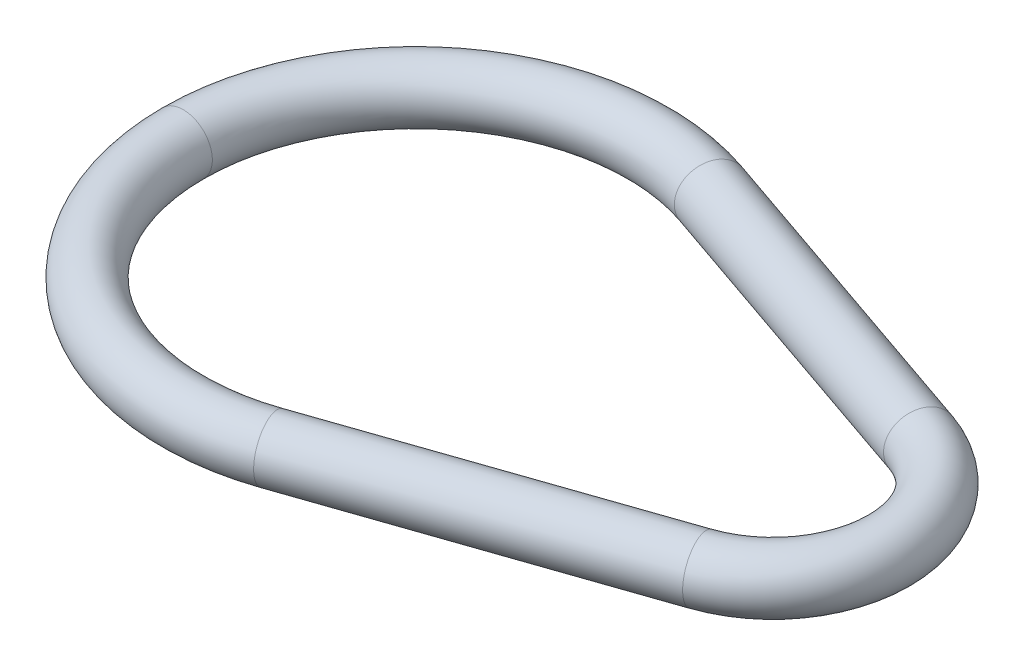
ISO-10303-21;
HEADER;
FILE_DESCRIPTION(('STEP AP214'),'2;1');
FILE_NAME('part.step','',(''),(''),'','','');
FILE_SCHEMA(('AUTOMOTIVE_DESIGN { 1 0 10303 214 1 1 1 1 }'));
ENDSEC;
DATA;
#1=APPLICATION_CONTEXT('core data for automotive mechanical design processes');
#2=APPLICATION_PROTOCOL_DEFINITION('international standard','automotive_design',2000,#1);
#3=PRODUCT_CONTEXT('',#1,'mechanical');
#4=PRODUCT('Part','Part','',(#3));
#5=PRODUCT_RELATED_PRODUCT_CATEGORY('part','',(#4));
#6=PRODUCT_DEFINITION_FORMATION('','',#4);
#7=PRODUCT_DEFINITION_CONTEXT('part definition',#1,'design');
#8=PRODUCT_DEFINITION('design','',#6,#7);
#9=PRODUCT_DEFINITION_SHAPE('','',#8);
#10=(LENGTH_UNIT() NAMED_UNIT(*) SI_UNIT(.MILLI.,.METRE.));
#11=(NAMED_UNIT(*) PLANE_ANGLE_UNIT() SI_UNIT($,.RADIAN.));
#12=(NAMED_UNIT(*) SI_UNIT($,.STERADIAN.) SOLID_ANGLE_UNIT());
#13=UNCERTAINTY_MEASURE_WITH_UNIT(LENGTH_MEASURE(1.E-05),#10,'distance_accuracy_value','');
#14=(GEOMETRIC_REPRESENTATION_CONTEXT(3) GLOBAL_UNCERTAINTY_ASSIGNED_CONTEXT((#13)) GLOBAL_UNIT_ASSIGNED_CONTEXT((#10,
#11,#12)) REPRESENTATION_CONTEXT('',''));
#15=CARTESIAN_POINT('',(0.,0.,0.));
#16=DIRECTION('',(0.,0.,1.));
#17=DIRECTION('',(1.,0.,0.));
#18=AXIS2_PLACEMENT_3D('',#15,#16,#17);
#19=CARTESIAN_POINT('',(0.,0.,0.));
#20=DIRECTION('',(0.,-1.,0.));
#21=DIRECTION('',(0.,0.,-1.));
#22=AXIS2_PLACEMENT_3D('',#19,#20,#21);
#23=TOROIDAL_SURFACE('',#22,25.4,3.175);
#24=CARTESIAN_POINT('',(-25.4,0.,0.));
#25=DIRECTION('',(0.,0.,1.));
#26=DIRECTION('',(1.,0.,0.));
#27=AXIS2_PLACEMENT_3D('',#24,#25,#26);
#28=CIRCLE('',#27,3.175);
#29=CARTESIAN_POINT('',(-28.575,0.,0.));
#30=VERTEX_POINT('',#29);
#31=EDGE_CURVE('E50',#30,#30,#28,.T.);
#32=CARTESIAN_POINT('',(8.27128205128204,0.,-24.0155344147937));
#33=DIRECTION('',(-0.945493480897389,0.,-0.325641025641025));
#34=DIRECTION('',(-0.325641025641025,0.,0.945493480897389));
#35=AXIS2_PLACEMENT_3D('',#32,#33,#34);
#36=CIRCLE('',#35,3.175);
#37=CARTESIAN_POINT('',(9.3051923076923,0.,-27.0174762166429));
#38=VERTEX_POINT('',#37);
#39=EDGE_CURVE('E45',#38,#38,#36,.T.);
#40=CARTESIAN_POINT('',(0.,0.,0.));
#41=DIRECTION('',(0.,-1.,0.));
#42=DIRECTION('',(0.,0.,-1.));
#43=AXIS2_PLACEMENT_3D('',#40,#41,#42);
#44=CIRCLE('',#43,28.575);
#45=EDGE_CURVE('',#30,#38,#44,.T.);
#46=ORIENTED_EDGE('',*,*,#31,.F.);
#47=ORIENTED_EDGE('',*,*,#39,.T.);
#48=ORIENTED_EDGE('',*,*,#45,.T.);
#49=ORIENTED_EDGE('',*,*,#45,.F.);
#50=EDGE_LOOP('',(#46,#48,#47,#49));
#51=FACE_BOUND('',#50,.T.);
#52=ADVANCED_FACE('F30',(#51),#23,.T.);
#53=CARTESIAN_POINT('',(8.27128205128205,0.,-24.0155344147937));
#54=DIRECTION('',(0.945493480897389,0.,0.325641025641026));
#55=DIRECTION('',(0.325641025641026,0.,-0.945493480897389));
#56=AXIS2_PLACEMENT_3D('',#53,#54,#55);
#57=CYLINDRICAL_SURFACE('',#56,3.175);
#58=CARTESIAN_POINT('',(43.135641025641,0.,-12.0077672073968));
#59=DIRECTION('',(-0.945493480897389,0.,-0.325641025641025));
#60=DIRECTION('',(-0.325641025641025,0.,0.945493480897389));
#61=AXIS2_PLACEMENT_3D('',#58,#59,#60);
#62=CIRCLE('',#61,3.175);
#63=CARTESIAN_POINT('',(44.1695512820513,0.,-15.009709009246));
#64=VERTEX_POINT('',#63);
#65=EDGE_CURVE('E41',#64,#64,#62,.T.);
#66=ORIENTED_EDGE('',*,*,#65,.T.);
#67=EDGE_LOOP('',(#66));
#68=FACE_BOUND('',#67,.T.);
#69=ORIENTED_EDGE('',*,*,#39,.F.);
#70=EDGE_LOOP('',(#69));
#71=FACE_BOUND('',#70,.T.);
#72=ADVANCED_FACE('F57',(#68,#71),#57,.T.);
#73=CARTESIAN_POINT('',(39.,0.,0.));
#74=DIRECTION('',(0.,-1.,0.));
#75=DIRECTION('',(0.,0.,-1.));
#76=AXIS2_PLACEMENT_3D('',#73,#74,#75);
#77=TOROIDAL_SURFACE('',#76,12.7,3.175);
#78=CARTESIAN_POINT('',(43.135641025641,0.,12.0077672073968));
#79=DIRECTION('',(0.945493480897388,0.,-0.325641025641027));
#80=DIRECTION('',(-0.325641025641027,0.,-0.945493480897388));
#81=AXIS2_PLACEMENT_3D('',#78,#79,#80);
#82=CIRCLE('',#81,3.175);
#83=CARTESIAN_POINT('',(44.1695512820513,0.,15.009709009246));
#84=VERTEX_POINT('',#83);
#85=EDGE_CURVE('E37',#84,#84,#82,.T.);
#86=CARTESIAN_POINT('',(39.,0.,0.));
#87=DIRECTION('',(0.,-1.,0.));
#88=DIRECTION('',(0.,0.,-1.));
#89=AXIS2_PLACEMENT_3D('',#86,#87,#88);
#90=CIRCLE('',#89,15.875);
#91=EDGE_CURVE('',#64,#84,#90,.T.);
#92=ORIENTED_EDGE('',*,*,#65,.F.);
#93=ORIENTED_EDGE('',*,*,#85,.T.);
#94=ORIENTED_EDGE('',*,*,#91,.T.);
#95=ORIENTED_EDGE('',*,*,#91,.F.);
#96=EDGE_LOOP('',(#92,#94,#93,#95));
#97=FACE_BOUND('',#96,.T.);
#98=ADVANCED_FACE('F63',(#97),#77,.T.);
#99=CARTESIAN_POINT('',(43.135641025641,0.,12.0077672073968));
#100=DIRECTION('',(-0.945493480897389,0.,0.325641025641026));
#101=DIRECTION('',(0.325641025641026,0.,0.945493480897389));
#102=AXIS2_PLACEMENT_3D('',#99,#100,#101);
#103=CYLINDRICAL_SURFACE('',#102,3.175);
#104=CARTESIAN_POINT('',(8.27128205128206,0.,24.0155344147937));
#105=DIRECTION('',(0.945493480897389,0.,-0.325641025641026));
#106=DIRECTION('',(-0.325641025641026,0.,-0.945493480897389));
#107=AXIS2_PLACEMENT_3D('',#104,#105,#106);
#108=CIRCLE('',#107,3.175);
#109=CARTESIAN_POINT('',(9.30519230769231,0.,27.0174762166429));
#110=VERTEX_POINT('',#109);
#111=EDGE_CURVE('E10',#110,#110,#108,.T.);
#112=ORIENTED_EDGE('',*,*,#111,.T.);
#113=EDGE_LOOP('',(#112));
#114=FACE_BOUND('',#113,.T.);
#115=ORIENTED_EDGE('',*,*,#85,.F.);
#116=EDGE_LOOP('',(#115));
#117=FACE_BOUND('',#116,.T.);
#118=ADVANCED_FACE('F68',(#114,#117),#103,.T.);
#119=CARTESIAN_POINT('',(0.,0.,0.));
#120=DIRECTION('',(0.,-1.,0.));
#121=DIRECTION('',(0.,0.,-1.));
#122=AXIS2_PLACEMENT_3D('',#119,#120,#121);
#123=TOROIDAL_SURFACE('',#122,25.4,3.175);
#124=CARTESIAN_POINT('',(0.,0.,0.));
#125=DIRECTION('',(0.,-1.,0.));
#126=DIRECTION('',(0.,0.,-1.));
#127=AXIS2_PLACEMENT_3D('',#124,#125,#126);
#128=CIRCLE('',#127,28.575);
#129=EDGE_CURVE('',#110,#30,#128,.T.);
#130=ORIENTED_EDGE('',*,*,#111,.F.);
#131=ORIENTED_EDGE('',*,*,#31,.T.);
#132=ORIENTED_EDGE('',*,*,#129,.T.);
#133=ORIENTED_EDGE('',*,*,#129,.F.);
#134=EDGE_LOOP('',(#130,#132,#131,#133));
#135=FACE_BOUND('',#134,.T.);
#136=ADVANCED_FACE('F32',(#135),#123,.T.);
#137=CLOSED_SHELL('',(#52,#72,#98,#118,#136));
#138=MANIFOLD_SOLID_BREP('B2',#137);
#139=ADVANCED_BREP_SHAPE_REPRESENTATION('',(#18,#138),#14);
#140=SHAPE_DEFINITION_REPRESENTATION(#9,#139);
ENDSEC;
END-ISO-10303-21;
